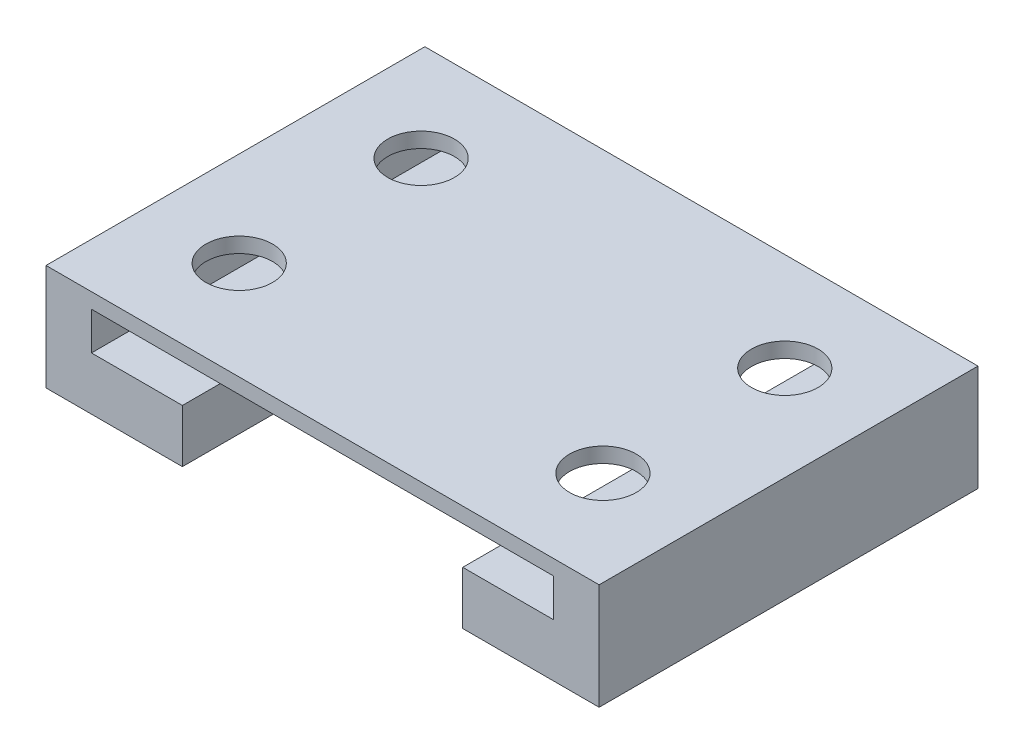
ISO-10303-21;
HEADER;
FILE_DESCRIPTION(('STEP AP214'),'2;1');
FILE_NAME('part.step','',(''),(''),'','','');
FILE_SCHEMA(('AUTOMOTIVE_DESIGN { 1 0 10303 214 1 1 1 1 }'));
ENDSEC;
DATA;
#1=APPLICATION_CONTEXT('core data for automotive mechanical design processes');
#2=APPLICATION_PROTOCOL_DEFINITION('international standard','automotive_design',2000,#1);
#3=PRODUCT_CONTEXT('',#1,'mechanical');
#4=PRODUCT('Part','Part','',(#3));
#5=PRODUCT_RELATED_PRODUCT_CATEGORY('part','',(#4));
#6=PRODUCT_DEFINITION_FORMATION('','',#4);
#7=PRODUCT_DEFINITION_CONTEXT('part definition',#1,'design');
#8=PRODUCT_DEFINITION('design','',#6,#7);
#9=PRODUCT_DEFINITION_SHAPE('','',#8);
#10=(LENGTH_UNIT() NAMED_UNIT(*) SI_UNIT(.MILLI.,.METRE.));
#11=(NAMED_UNIT(*) PLANE_ANGLE_UNIT() SI_UNIT($,.RADIAN.));
#12=(NAMED_UNIT(*) SI_UNIT($,.STERADIAN.) SOLID_ANGLE_UNIT());
#13=UNCERTAINTY_MEASURE_WITH_UNIT(LENGTH_MEASURE(1.E-05),#10,'distance_accuracy_value','');
#14=(GEOMETRIC_REPRESENTATION_CONTEXT(3) GLOBAL_UNCERTAINTY_ASSIGNED_CONTEXT((#13)) GLOBAL_UNIT_ASSIGNED_CONTEXT((#10,
#11,#12)) REPRESENTATION_CONTEXT('',''));
#15=CARTESIAN_POINT('',(0.,0.,0.));
#16=DIRECTION('',(0.,0.,1.));
#17=DIRECTION('',(1.,0.,0.));
#18=AXIS2_PLACEMENT_3D('',#15,#16,#17);
#19=CARTESIAN_POINT('',(-9.25000000000013,3.49999999999995,12.5000000000003));
#20=DIRECTION('',(-1.,0.,0.));
#21=DIRECTION('',(0.,-1.,0.));
#22=AXIS2_PLACEMENT_3D('',#19,#20,#21);
#23=PLANE('',#22);
#24=DIRECTION('',(0.,1.,0.));
#25=VECTOR('',#24,1.);
#26=CARTESIAN_POINT('',(-9.24999999999999,3.49999999999895,-12.5));
#27=LINE('',#26,#25);
#28=CARTESIAN_POINT('',(-9.24999999999999,-1.11022302462516E-12,-12.5));
#29=VERTEX_POINT('',#28);
#30=CARTESIAN_POINT('',(-9.24999999999999,3.49999999999895,-12.5));
#31=VERTEX_POINT('',#30);
#32=EDGE_CURVE('E165',#29,#31,#27,.T.);
#33=ORIENTED_EDGE('',*,*,#32,.T.);
#34=DIRECTION('',(0.,0.,-1.));
#35=VECTOR('',#34,1.);
#36=CARTESIAN_POINT('',(-9.25000000000013,3.49999999999995,12.5000000000003));
#37=LINE('',#36,#35);
#38=CARTESIAN_POINT('',(-9.25000000000013,3.49999999999995,12.5000000000003));
#39=VERTEX_POINT('',#38);
#40=EDGE_CURVE('E11',#39,#31,#37,.T.);
#41=ORIENTED_EDGE('',*,*,#40,.F.);
#42=DIRECTION('',(0.,1.,0.));
#43=VECTOR('',#42,1.);
#44=CARTESIAN_POINT('',(-9.25000000000013,3.49999999999995,12.5000000000003));
#45=LINE('',#44,#43);
#46=CARTESIAN_POINT('',(-9.25000000000013,0.,12.5000000000003));
#47=VERTEX_POINT('',#46);
#48=EDGE_CURVE('E200',#47,#39,#45,.T.);
#49=ORIENTED_EDGE('',*,*,#48,.F.);
#50=DIRECTION('',(0.,0.,-1.));
#51=VECTOR('',#50,1.);
#52=CARTESIAN_POINT('',(-9.25000000000013,0.,12.5000000000003));
#53=LINE('',#52,#51);
#54=EDGE_CURVE('E161',#47,#29,#53,.T.);
#55=ORIENTED_EDGE('',*,*,#54,.T.);
#56=EDGE_LOOP('',(#33,#41,#49,#55));
#57=FACE_BOUND('',#56,.T.);
#58=ADVANCED_FACE('F38',(#57),#23,.F.);
#59=CARTESIAN_POINT('',(-15.2500000000001,3.49999999999995,12.5));
#60=DIRECTION('',(0.,-1.,0.));
#61=DIRECTION('',(0.,0.,-1.));
#62=AXIS2_PLACEMENT_3D('',#59,#60,#61);
#63=PLANE('',#62);
#64=CARTESIAN_POINT('',(-12.,3.49999999999895,-6.00000000000028));
#65=DIRECTION('',(0.,-1.,0.));
#66=DIRECTION('',(0.,0.,-1.));
#67=AXIS2_PLACEMENT_3D('',#64,#65,#66);
#68=CIRCLE('',#67,1.2);
#69=CARTESIAN_POINT('',(-12.,3.49999999999895,-7.20000000000029));
#70=VERTEX_POINT('',#69);
#71=EDGE_CURVE('E278',#70,#70,#68,.T.);
#72=ORIENTED_EDGE('',*,*,#71,.T.);
#73=EDGE_LOOP('',(#72));
#74=FACE_BOUND('',#73,.T.);
#75=CARTESIAN_POINT('',(-12.,3.49999999999995,6.00000000000001));
#76=DIRECTION('',(0.,-1.,0.));
#77=DIRECTION('',(0.,0.,-1.));
#78=AXIS2_PLACEMENT_3D('',#75,#76,#77);
#79=CIRCLE('',#78,1.2);
#80=CARTESIAN_POINT('',(-12.,3.49999999999995,4.8));
#81=VERTEX_POINT('',#80);
#82=EDGE_CURVE('E315',#81,#81,#79,.T.);
#83=ORIENTED_EDGE('',*,*,#82,.T.);
#84=EDGE_LOOP('',(#83));
#85=FACE_BOUND('',#84,.T.);
#86=DIRECTION('',(-1.,0.,0.));
#87=VECTOR('',#86,1.);
#88=CARTESIAN_POINT('',(-15.25,3.49999999999895,-12.5000000000003));
#89=LINE('',#88,#87);
#90=CARTESIAN_POINT('',(-15.25,3.49999999999895,-12.5000000000003));
#91=VERTEX_POINT('',#90);
#92=EDGE_CURVE('E169',#31,#91,#89,.T.);
#93=ORIENTED_EDGE('',*,*,#92,.T.);
#94=DIRECTION('',(0.,0.,-1.));
#95=VECTOR('',#94,1.);
#96=CARTESIAN_POINT('',(-15.2500000000001,3.49999999999995,12.5));
#97=LINE('',#96,#95);
#98=CARTESIAN_POINT('',(-15.2500000000001,3.49999999999995,12.5));
#99=VERTEX_POINT('',#98);
#100=EDGE_CURVE('E47',#99,#91,#97,.T.);
#101=ORIENTED_EDGE('',*,*,#100,.F.);
#102=DIRECTION('',(-1.,0.,0.));
#103=VECTOR('',#102,1.);
#104=CARTESIAN_POINT('',(-15.2500000000001,3.49999999999995,12.5));
#105=LINE('',#104,#103);
#106=EDGE_CURVE('E110',#39,#99,#105,.T.);
#107=ORIENTED_EDGE('',*,*,#106,.F.);
#108=ORIENTED_EDGE('',*,*,#40,.T.);
#109=EDGE_LOOP('',(#93,#101,#107,#108));
#110=FACE_BOUND('',#109,.T.);
#111=ADVANCED_FACE('F341',(#74,#85,#110),#63,.F.);
#112=CARTESIAN_POINT('',(-15.2500000000001,6.00000000000001,12.5));
#113=DIRECTION('',(-1.,0.,0.));
#114=DIRECTION('',(0.,0.,1.));
#115=AXIS2_PLACEMENT_3D('',#112,#113,#114);
#116=PLANE('',#115);
#117=DIRECTION('',(0.,1.,0.));
#118=VECTOR('',#117,1.);
#119=CARTESIAN_POINT('',(-15.25,5.9999999999989,-12.5000000000003));
#120=LINE('',#119,#118);
#121=CARTESIAN_POINT('',(-15.25,5.9999999999989,-12.5000000000003));
#122=VERTEX_POINT('',#121);
#123=EDGE_CURVE('E173',#91,#122,#120,.T.);
#124=ORIENTED_EDGE('',*,*,#123,.T.);
#125=DIRECTION('',(0.,0.,-1.));
#126=VECTOR('',#125,1.);
#127=CARTESIAN_POINT('',(-15.2500000000001,6.00000000000001,12.5));
#128=LINE('',#127,#126);
#129=CARTESIAN_POINT('',(-15.2500000000001,6.00000000000001,12.5));
#130=VERTEX_POINT('',#129);
#131=EDGE_CURVE('E226',#130,#122,#128,.T.);
#132=ORIENTED_EDGE('',*,*,#131,.F.);
#133=DIRECTION('',(0.,1.,0.));
#134=VECTOR('',#133,1.);
#135=CARTESIAN_POINT('',(-15.2500000000001,6.00000000000001,12.5));
#136=LINE('',#135,#134);
#137=EDGE_CURVE('E238',#99,#130,#136,.T.);
#138=ORIENTED_EDGE('',*,*,#137,.F.);
#139=ORIENTED_EDGE('',*,*,#100,.T.);
#140=EDGE_LOOP('',(#124,#132,#138,#139));
#141=FACE_BOUND('',#140,.T.);
#142=ADVANCED_FACE('F236',(#141),#116,.F.);
#143=CARTESIAN_POINT('',(15.2500000000003,6.00000000000006,12.5000000000003));
#144=DIRECTION('',(0.,1.,0.));
#145=DIRECTION('',(-1.,0.,0.));
#146=AXIS2_PLACEMENT_3D('',#143,#144,#145);
#147=PLANE('',#146);
#148=CARTESIAN_POINT('',(-12.,5.9999999999989,-6.00000000000028));
#149=DIRECTION('',(0.,1.,0.));
#150=DIRECTION('',(-1.,0.,0.));
#151=AXIS2_PLACEMENT_3D('',#148,#149,#150);
#152=CIRCLE('',#151,2.2);
#153=CARTESIAN_POINT('',(-14.2,5.9999999999989,-6.00000000000028));
#154=VERTEX_POINT('',#153);
#155=EDGE_CURVE('E272',#154,#154,#152,.F.);
#156=ORIENTED_EDGE('',*,*,#155,.F.);
#157=EDGE_LOOP('',(#156));
#158=FACE_BOUND('',#157,.T.);
#159=CARTESIAN_POINT('',(12.,6.00000000000106,-6.00000000000028));
#160=DIRECTION('',(0.,1.,0.));
#161=DIRECTION('',(-1.,0.,0.));
#162=AXIS2_PLACEMENT_3D('',#159,#160,#161);
#163=CIRCLE('',#162,2.2);
#164=CARTESIAN_POINT('',(9.79999999999997,6.00000000000106,-6.00000000000028));
#165=VERTEX_POINT('',#164);
#166=EDGE_CURVE('E289',#165,#165,#163,.F.);
#167=ORIENTED_EDGE('',*,*,#166,.F.);
#168=EDGE_LOOP('',(#167));
#169=FACE_BOUND('',#168,.T.);
#170=CARTESIAN_POINT('',(12.,6.00000000000006,6.00000000000001));
#171=DIRECTION('',(0.,1.,0.));
#172=DIRECTION('',(-1.,0.,0.));
#173=AXIS2_PLACEMENT_3D('',#170,#171,#172);
#174=CIRCLE('',#173,2.2);
#175=CARTESIAN_POINT('',(9.79999999999997,6.00000000000006,6.00000000000001));
#176=VERTEX_POINT('',#175);
#177=EDGE_CURVE('E284',#176,#176,#174,.F.);
#178=ORIENTED_EDGE('',*,*,#177,.F.);
#179=EDGE_LOOP('',(#178));
#180=FACE_BOUND('',#179,.T.);
#181=CARTESIAN_POINT('',(-12.,6.00000000000001,6.00000000000001));
#182=DIRECTION('',(0.,1.,0.));
#183=DIRECTION('',(-1.,0.,0.));
#184=AXIS2_PLACEMENT_3D('',#181,#182,#183);
#185=CIRCLE('',#184,2.2);
#186=CARTESIAN_POINT('',(-14.2,6.00000000000001,6.00000000000001));
#187=VERTEX_POINT('',#186);
#188=EDGE_CURVE('E306',#187,#187,#185,.F.);
#189=ORIENTED_EDGE('',*,*,#188,.F.);
#190=EDGE_LOOP('',(#189));
#191=FACE_BOUND('',#190,.T.);
#192=DIRECTION('',(1.,0.,0.));
#193=VECTOR('',#192,1.);
#194=CARTESIAN_POINT('',(15.2500000000003,5.99999999999995,-12.5));
#195=LINE('',#194,#193);
#196=CARTESIAN_POINT('',(15.2500000000003,5.99999999999995,-12.5));
#197=VERTEX_POINT('',#196);
#198=EDGE_CURVE('E176',#122,#197,#195,.T.);
#199=ORIENTED_EDGE('',*,*,#198,.T.);
#200=DIRECTION('',(0.,0.,-1.));
#201=VECTOR('',#200,1.);
#202=CARTESIAN_POINT('',(15.2500000000003,6.00000000000006,12.5000000000003));
#203=LINE('',#202,#201);
#204=CARTESIAN_POINT('',(15.2500000000003,6.00000000000006,12.5000000000003));
#205=VERTEX_POINT('',#204);
#206=EDGE_CURVE('E222',#205,#197,#203,.T.);
#207=ORIENTED_EDGE('',*,*,#206,.F.);
#208=DIRECTION('',(1.,0.,0.));
#209=VECTOR('',#208,1.);
#210=CARTESIAN_POINT('',(15.2500000000003,6.00000000000006,12.5000000000003));
#211=LINE('',#210,#209);
#212=EDGE_CURVE('E257',#130,#205,#211,.T.);
#213=ORIENTED_EDGE('',*,*,#212,.F.);
#214=ORIENTED_EDGE('',*,*,#131,.T.);
#215=EDGE_LOOP('',(#199,#207,#213,#214));
#216=FACE_BOUND('',#215,.T.);
#217=ADVANCED_FACE('F247',(#158,#169,#180,#191,#216),#147,.F.);
#218=CARTESIAN_POINT('',(15.2500000000003,3.5,12.5000000000003));
#219=DIRECTION('',(1.,0.,0.));
#220=DIRECTION('',(0.,0.,-1.));
#221=AXIS2_PLACEMENT_3D('',#218,#219,#220);
#222=PLANE('',#221);
#223=DIRECTION('',(0.,-1.,0.));
#224=VECTOR('',#223,1.);
#225=CARTESIAN_POINT('',(15.2500000000002,3.5,-12.5));
#226=LINE('',#225,#224);
#227=CARTESIAN_POINT('',(15.2500000000002,3.5,-12.5));
#228=VERTEX_POINT('',#227);
#229=EDGE_CURVE('E179',#197,#228,#226,.T.);
#230=ORIENTED_EDGE('',*,*,#229,.T.);
#231=DIRECTION('',(0.,0.,-1.));
#232=VECTOR('',#231,1.);
#233=CARTESIAN_POINT('',(15.2500000000003,3.5,12.5000000000003));
#234=LINE('',#233,#232);
#235=CARTESIAN_POINT('',(15.2500000000003,3.5,12.5000000000003));
#236=VERTEX_POINT('',#235);
#237=EDGE_CURVE('E218',#236,#228,#234,.T.);
#238=ORIENTED_EDGE('',*,*,#237,.F.);
#239=DIRECTION('',(0.,-1.,0.));
#240=VECTOR('',#239,1.);
#241=CARTESIAN_POINT('',(15.2500000000003,3.5,12.5000000000003));
#242=LINE('',#241,#240);
#243=EDGE_CURVE('E253',#205,#236,#242,.T.);
#244=ORIENTED_EDGE('',*,*,#243,.F.);
#245=ORIENTED_EDGE('',*,*,#206,.T.);
#246=EDGE_LOOP('',(#230,#238,#244,#245));
#247=FACE_BOUND('',#246,.T.);
#248=ADVANCED_FACE('F251',(#247),#222,.F.);
#249=CARTESIAN_POINT('',(9.25000000000029,3.5,12.5));
#250=DIRECTION('',(0.,-1.,0.));
#251=DIRECTION('',(1.,0.,0.));
#252=AXIS2_PLACEMENT_3D('',#249,#250,#251);
#253=PLANE('',#252);
#254=CARTESIAN_POINT('',(12.,3.5,6.00000000000001));
#255=DIRECTION('',(0.,-1.,0.));
#256=DIRECTION('',(1.,0.,0.));
#257=AXIS2_PLACEMENT_3D('',#254,#255,#256);
#258=CIRCLE('',#257,1.2);
#259=CARTESIAN_POINT('',(13.2,3.5,6.00000000000001));
#260=VERTEX_POINT('',#259);
#261=EDGE_CURVE('E323',#260,#260,#258,.T.);
#262=ORIENTED_EDGE('',*,*,#261,.T.);
#263=EDGE_LOOP('',(#262));
#264=FACE_BOUND('',#263,.T.);
#265=CARTESIAN_POINT('',(11.9999999999999,3.50000000000011,-6.00000000000028));
#266=DIRECTION('',(0.,-1.,0.));
#267=DIRECTION('',(1.,0.,0.));
#268=AXIS2_PLACEMENT_3D('',#265,#266,#267);
#269=CIRCLE('',#268,1.2);
#270=CARTESIAN_POINT('',(13.1999999999999,3.50000000000011,-6.00000000000028));
#271=VERTEX_POINT('',#270);
#272=EDGE_CURVE('E170',#271,#271,#269,.T.);
#273=ORIENTED_EDGE('',*,*,#272,.T.);
#274=EDGE_LOOP('',(#273));
#275=FACE_BOUND('',#274,.T.);
#276=DIRECTION('',(-1.,0.,0.));
#277=VECTOR('',#276,1.);
#278=CARTESIAN_POINT('',(9.25000000000009,3.5,-12.5000000000003));
#279=LINE('',#278,#277);
#280=CARTESIAN_POINT('',(9.25000000000009,3.5,-12.5000000000003));
#281=VERTEX_POINT('',#280);
#282=EDGE_CURVE('E182',#228,#281,#279,.T.);
#283=ORIENTED_EDGE('',*,*,#282,.T.);
#284=DIRECTION('',(0.,0.,-1.));
#285=VECTOR('',#284,1.);
#286=CARTESIAN_POINT('',(9.25000000000029,3.5,12.5));
#287=LINE('',#286,#285);
#288=CARTESIAN_POINT('',(9.25000000000029,3.5,12.5));
#289=VERTEX_POINT('',#288);
#290=EDGE_CURVE('E214',#289,#281,#287,.T.);
#291=ORIENTED_EDGE('',*,*,#290,.F.);
#292=DIRECTION('',(-1.,0.,0.));
#293=VECTOR('',#292,1.);
#294=CARTESIAN_POINT('',(9.25000000000029,3.5,12.5));
#295=LINE('',#294,#293);
#296=EDGE_CURVE('E256',#236,#289,#295,.T.);
#297=ORIENTED_EDGE('',*,*,#296,.F.);
#298=ORIENTED_EDGE('',*,*,#237,.T.);
#299=EDGE_LOOP('',(#283,#291,#297,#298));
#300=FACE_BOUND('',#299,.T.);
#301=ADVANCED_FACE('F356',(#264,#275,#300),#253,.F.);
#302=CARTESIAN_POINT('',(9.25000000000029,0.,12.5));
#303=DIRECTION('',(1.,0.,0.));
#304=DIRECTION('',(0.,1.,0.));
#305=AXIS2_PLACEMENT_3D('',#302,#303,#304);
#306=PLANE('',#305);
#307=DIRECTION('',(0.,-1.,0.));
#308=VECTOR('',#307,1.);
#309=CARTESIAN_POINT('',(9.25000000000009,0.,-12.5000000000003));
#310=LINE('',#309,#308);
#311=CARTESIAN_POINT('',(9.25000000000009,0.,-12.5000000000003));
#312=VERTEX_POINT('',#311);
#313=EDGE_CURVE('E185',#281,#312,#310,.T.);
#314=ORIENTED_EDGE('',*,*,#313,.T.);
#315=DIRECTION('',(0.,0.,-1.));
#316=VECTOR('',#315,1.);
#317=CARTESIAN_POINT('',(9.25000000000029,0.,12.5));
#318=LINE('',#317,#316);
#319=CARTESIAN_POINT('',(9.25000000000029,0.,12.5));
#320=VERTEX_POINT('',#319);
#321=EDGE_CURVE('E210',#320,#312,#318,.T.);
#322=ORIENTED_EDGE('',*,*,#321,.F.);
#323=DIRECTION('',(0.,-1.,0.));
#324=VECTOR('',#323,1.);
#325=CARTESIAN_POINT('',(9.25000000000029,0.,12.5));
#326=LINE('',#325,#324);
#327=EDGE_CURVE('E262',#289,#320,#326,.T.);
#328=ORIENTED_EDGE('',*,*,#327,.F.);
#329=ORIENTED_EDGE('',*,*,#290,.T.);
#330=EDGE_LOOP('',(#314,#322,#328,#329));
#331=FACE_BOUND('',#330,.T.);
#332=ADVANCED_FACE('F359',(#331),#306,.F.);
#333=CARTESIAN_POINT('',(18.2500000000002,0.,12.5000000000005));
#334=DIRECTION('',(0.,1.,0.));
#335=DIRECTION('',(-1.,0.,0.));
#336=AXIS2_PLACEMENT_3D('',#333,#334,#335);
#337=PLANE('',#336);
#338=CARTESIAN_POINT('',(12.,0.,6.00000000000001));
#339=DIRECTION('',(0.,1.,0.));
#340=DIRECTION('',(0.,0.,1.));
#341=AXIS2_PLACEMENT_3D('',#338,#339,#340);
#342=CIRCLE('',#341,1.2);
#343=CARTESIAN_POINT('',(12.,0.,7.20000000000001));
#344=VERTEX_POINT('',#343);
#345=EDGE_CURVE('E319',#344,#344,#342,.T.);
#346=ORIENTED_EDGE('',*,*,#345,.T.);
#347=EDGE_LOOP('',(#346));
#348=FACE_BOUND('',#347,.T.);
#349=CARTESIAN_POINT('',(11.9999999999999,1.0547118733939E-12,-6.00000000000028));
#350=DIRECTION('',(0.,1.,0.));
#351=DIRECTION('',(0.,0.,1.));
#352=AXIS2_PLACEMENT_3D('',#349,#350,#351);
#353=CIRCLE('',#352,1.2);
#354=CARTESIAN_POINT('',(11.9999999999999,1.0547118733939E-12,-4.80000000000028));
#355=VERTEX_POINT('',#354);
#356=EDGE_CURVE('E327',#355,#355,#353,.T.);
#357=ORIENTED_EDGE('',*,*,#356,.T.);
#358=EDGE_LOOP('',(#357));
#359=FACE_BOUND('',#358,.T.);
#360=DIRECTION('',(1.,0.,0.));
#361=VECTOR('',#360,1.);
#362=CARTESIAN_POINT('',(18.2500000000002,0.,-12.5000000000001));
#363=LINE('',#362,#361);
#364=CARTESIAN_POINT('',(18.2500000000002,0.,-12.5000000000001));
#365=VERTEX_POINT('',#364);
#366=EDGE_CURVE('E188',#312,#365,#363,.T.);
#367=ORIENTED_EDGE('',*,*,#366,.T.);
#368=DIRECTION('',(0.,0.,-1.));
#369=VECTOR('',#368,1.);
#370=CARTESIAN_POINT('',(18.2500000000002,0.,12.5000000000005));
#371=LINE('',#370,#369);
#372=CARTESIAN_POINT('',(18.2500000000002,0.,12.5000000000005));
#373=VERTEX_POINT('',#372);
#374=EDGE_CURVE('E206',#373,#365,#371,.T.);
#375=ORIENTED_EDGE('',*,*,#374,.F.);
#376=DIRECTION('',(1.,0.,0.));
#377=VECTOR('',#376,1.);
#378=CARTESIAN_POINT('',(18.2500000000002,0.,12.5000000000005));
#379=LINE('',#378,#377);
#380=EDGE_CURVE('E268',#320,#373,#379,.T.);
#381=ORIENTED_EDGE('',*,*,#380,.F.);
#382=ORIENTED_EDGE('',*,*,#321,.T.);
#383=EDGE_LOOP('',(#367,#375,#381,#382));
#384=FACE_BOUND('',#383,.T.);
#385=ADVANCED_FACE('F363',(#348,#359,#384),#337,.F.);
#386=CARTESIAN_POINT('',(18.2500000000002,7.00000000000006,12.5000000000005));
#387=DIRECTION('',(-1.,0.,0.));
#388=DIRECTION('',(0.,0.,1.));
#389=AXIS2_PLACEMENT_3D('',#386,#387,#388);
#390=PLANE('',#389);
#391=DIRECTION('',(0.,1.,0.));
#392=VECTOR('',#391,1.);
#393=CARTESIAN_POINT('',(18.2500000000002,6.99999999999995,-12.5));
#394=LINE('',#393,#392);
#395=CARTESIAN_POINT('',(18.2500000000002,6.99999999999995,-12.5));
#396=VERTEX_POINT('',#395);
#397=EDGE_CURVE('E191',#365,#396,#394,.T.);
#398=ORIENTED_EDGE('',*,*,#397,.T.);
#399=DIRECTION('',(0.,0.,-1.));
#400=VECTOR('',#399,1.);
#401=CARTESIAN_POINT('',(18.2500000000002,7.00000000000006,12.5000000000005));
#402=LINE('',#401,#400);
#403=CARTESIAN_POINT('',(18.2500000000002,7.00000000000006,12.5000000000005));
#404=VERTEX_POINT('',#403);
#405=EDGE_CURVE('E152',#404,#396,#402,.T.);
#406=ORIENTED_EDGE('',*,*,#405,.F.);
#407=DIRECTION('',(0.,1.,0.));
#408=VECTOR('',#407,1.);
#409=CARTESIAN_POINT('',(18.2500000000002,7.00000000000006,12.5000000000005));
#410=LINE('',#409,#408);
#411=EDGE_CURVE('E141',#373,#404,#410,.T.);
#412=ORIENTED_EDGE('',*,*,#411,.F.);
#413=ORIENTED_EDGE('',*,*,#374,.T.);
#414=EDGE_LOOP('',(#398,#406,#412,#413));
#415=FACE_BOUND('',#414,.T.);
#416=ADVANCED_FACE('F367',(#415),#390,.F.);
#417=CARTESIAN_POINT('',(-18.2500000000001,7.00000000000001,12.5000000000003));
#418=DIRECTION('',(0.,-1.,0.));
#419=DIRECTION('',(1.,0.,0.));
#420=AXIS2_PLACEMENT_3D('',#417,#418,#419);
#421=PLANE('',#420);
#422=CARTESIAN_POINT('',(-12.,6.9999999999989,-6.00000000000028));
#423=DIRECTION('',(0.,1.,0.));
#424=DIRECTION('',(-1.,0.,0.));
#425=AXIS2_PLACEMENT_3D('',#422,#423,#424);
#426=CIRCLE('',#425,2.2);
#427=CARTESIAN_POINT('',(-14.2,6.9999999999989,-6.00000000000028));
#428=VERTEX_POINT('',#427);
#429=EDGE_CURVE('E275',#428,#428,#426,.T.);
#430=ORIENTED_EDGE('',*,*,#429,.F.);
#431=EDGE_LOOP('',(#430));
#432=FACE_BOUND('',#431,.T.);
#433=CARTESIAN_POINT('',(-12.,7.00000000000001,6.00000000000001));
#434=DIRECTION('',(0.,1.,0.));
#435=DIRECTION('',(-1.,0.,0.));
#436=AXIS2_PLACEMENT_3D('',#433,#434,#435);
#437=CIRCLE('',#436,2.2);
#438=CARTESIAN_POINT('',(-14.2,7.00000000000001,6.00000000000001));
#439=VERTEX_POINT('',#438);
#440=EDGE_CURVE('E286',#439,#439,#437,.T.);
#441=ORIENTED_EDGE('',*,*,#440,.F.);
#442=EDGE_LOOP('',(#441));
#443=FACE_BOUND('',#442,.T.);
#444=CARTESIAN_POINT('',(12.,7.00000000000006,6.00000000000001));
#445=DIRECTION('',(0.,1.,0.));
#446=DIRECTION('',(-1.,0.,0.));
#447=AXIS2_PLACEMENT_3D('',#444,#445,#446);
#448=CIRCLE('',#447,2.2);
#449=CARTESIAN_POINT('',(9.79999999999997,7.00000000000006,6.00000000000001));
#450=VERTEX_POINT('',#449);
#451=EDGE_CURVE('E287',#450,#450,#448,.T.);
#452=ORIENTED_EDGE('',*,*,#451,.F.);
#453=EDGE_LOOP('',(#452));
#454=FACE_BOUND('',#453,.T.);
#455=CARTESIAN_POINT('',(12.,7.00000000000106,-6.00000000000028));
#456=DIRECTION('',(0.,1.,0.));
#457=DIRECTION('',(-1.,0.,0.));
#458=AXIS2_PLACEMENT_3D('',#455,#456,#457);
#459=CIRCLE('',#458,2.2);
#460=CARTESIAN_POINT('',(9.79999999999997,7.00000000000106,-6.00000000000028));
#461=VERTEX_POINT('',#460);
#462=EDGE_CURVE('E274',#461,#461,#459,.T.);
#463=ORIENTED_EDGE('',*,*,#462,.F.);
#464=EDGE_LOOP('',(#463));
#465=FACE_BOUND('',#464,.T.);
#466=DIRECTION('',(-1.,0.,0.));
#467=VECTOR('',#466,1.);
#468=CARTESIAN_POINT('',(-18.25,6.9999999999989,-12.5000000000003));
#469=LINE('',#468,#467);
#470=CARTESIAN_POINT('',(-18.25,6.9999999999989,-12.5000000000003));
#471=VERTEX_POINT('',#470);
#472=EDGE_CURVE('E150',#396,#471,#469,.T.);
#473=ORIENTED_EDGE('',*,*,#472,.T.);
#474=DIRECTION('',(0.,0.,-1.));
#475=VECTOR('',#474,1.);
#476=CARTESIAN_POINT('',(-18.2500000000001,7.00000000000001,12.5000000000003));
#477=LINE('',#476,#475);
#478=CARTESIAN_POINT('',(-18.2500000000001,7.00000000000001,12.5000000000003));
#479=VERTEX_POINT('',#478);
#480=EDGE_CURVE('E147',#479,#471,#477,.T.);
#481=ORIENTED_EDGE('',*,*,#480,.F.);
#482=DIRECTION('',(-1.,0.,0.));
#483=VECTOR('',#482,1.);
#484=CARTESIAN_POINT('',(-18.2500000000001,7.00000000000001,12.5000000000003));
#485=LINE('',#484,#483);
#486=EDGE_CURVE('E135',#404,#479,#485,.T.);
#487=ORIENTED_EDGE('',*,*,#486,.F.);
#488=ORIENTED_EDGE('',*,*,#405,.T.);
#489=EDGE_LOOP('',(#473,#481,#487,#488));
#490=FACE_BOUND('',#489,.T.);
#491=ADVANCED_FACE('F148',(#432,#443,#454,#465,#490),#421,.F.);
#492=CARTESIAN_POINT('',(-18.2500000000001,0.,12.5000000000001));
#493=DIRECTION('',(1.,0.,0.));
#494=DIRECTION('',(0.,0.,-1.));
#495=AXIS2_PLACEMENT_3D('',#492,#493,#494);
#496=PLANE('',#495);
#497=DIRECTION('',(0.,-1.,0.));
#498=VECTOR('',#497,1.);
#499=CARTESIAN_POINT('',(-18.25,-1.11022302462516E-12,-12.5000000000005));
#500=LINE('',#499,#498);
#501=CARTESIAN_POINT('',(-18.25,-1.11022302462516E-12,-12.5000000000005));
#502=VERTEX_POINT('',#501);
#503=EDGE_CURVE('E96',#471,#502,#500,.T.);
#504=ORIENTED_EDGE('',*,*,#503,.T.);
#505=DIRECTION('',(0.,0.,-1.));
#506=VECTOR('',#505,1.);
#507=CARTESIAN_POINT('',(-18.2500000000001,0.,12.5000000000001));
#508=LINE('',#507,#506);
#509=CARTESIAN_POINT('',(-18.2500000000001,0.,12.5000000000001));
#510=VERTEX_POINT('',#509);
#511=EDGE_CURVE('E153',#510,#502,#508,.T.);
#512=ORIENTED_EDGE('',*,*,#511,.F.);
#513=DIRECTION('',(0.,-1.,0.));
#514=VECTOR('',#513,1.);
#515=CARTESIAN_POINT('',(-18.2500000000001,0.,12.5000000000001));
#516=LINE('',#515,#514);
#517=EDGE_CURVE('E139',#479,#510,#516,.T.);
#518=ORIENTED_EDGE('',*,*,#517,.F.);
#519=ORIENTED_EDGE('',*,*,#480,.T.);
#520=EDGE_LOOP('',(#504,#512,#518,#519));
#521=FACE_BOUND('',#520,.T.);
#522=ADVANCED_FACE('F155',(#521),#496,.F.);
#523=CARTESIAN_POINT('',(-9.25000000000013,0.,12.5000000000003));
#524=DIRECTION('',(0.,1.,0.));
#525=DIRECTION('',(-1.,0.,0.));
#526=AXIS2_PLACEMENT_3D('',#523,#524,#525);
#527=PLANE('',#526);
#528=CARTESIAN_POINT('',(-12.,-1.11022302462516E-12,-6.00000000000028));
#529=DIRECTION('',(0.,1.,0.));
#530=DIRECTION('',(0.,0.,1.));
#531=AXIS2_PLACEMENT_3D('',#528,#529,#530);
#532=CIRCLE('',#531,1.2);
#533=CARTESIAN_POINT('',(-12.,-1.11022302462516E-12,-4.80000000000028));
#534=VERTEX_POINT('',#533);
#535=EDGE_CURVE('E282',#534,#534,#532,.T.);
#536=ORIENTED_EDGE('',*,*,#535,.T.);
#537=EDGE_LOOP('',(#536));
#538=FACE_BOUND('',#537,.T.);
#539=CARTESIAN_POINT('',(-12.,0.,6.00000000000001));
#540=DIRECTION('',(0.,1.,0.));
#541=DIRECTION('',(0.,0.,1.));
#542=AXIS2_PLACEMENT_3D('',#539,#540,#541);
#543=CIRCLE('',#542,1.2);
#544=CARTESIAN_POINT('',(-12.,0.,7.20000000000001));
#545=VERTEX_POINT('',#544);
#546=EDGE_CURVE('E281',#545,#545,#543,.T.);
#547=ORIENTED_EDGE('',*,*,#546,.T.);
#548=EDGE_LOOP('',(#547));
#549=FACE_BOUND('',#548,.T.);
#550=DIRECTION('',(1.,0.,0.));
#551=VECTOR('',#550,1.);
#552=CARTESIAN_POINT('',(-9.24999999999999,-1.11022302462516E-12,-12.5));
#553=LINE('',#552,#551);
#554=EDGE_CURVE('E102',#502,#29,#553,.T.);
#555=ORIENTED_EDGE('',*,*,#554,.T.);
#556=ORIENTED_EDGE('',*,*,#54,.F.);
#557=DIRECTION('',(1.,0.,0.));
#558=VECTOR('',#557,1.);
#559=CARTESIAN_POINT('',(-9.25000000000013,0.,12.5000000000003));
#560=LINE('',#559,#558);
#561=EDGE_CURVE('E55',#510,#47,#560,.T.);
#562=ORIENTED_EDGE('',*,*,#561,.F.);
#563=ORIENTED_EDGE('',*,*,#511,.T.);
#564=EDGE_LOOP('',(#555,#556,#562,#563));
#565=FACE_BOUND('',#564,.T.);
#566=ADVANCED_FACE('F377',(#538,#549,#565),#527,.F.);
#567=CARTESIAN_POINT('',(-1.38777878078145E-13,0.,12.5));
#568=DIRECTION('',(0.,0.,-1.));
#569=DIRECTION('',(-1.,0.,0.));
#570=AXIS2_PLACEMENT_3D('',#567,#568,#569);
#571=PLANE('',#570);
#572=ORIENTED_EDGE('',*,*,#48,.T.);
#573=ORIENTED_EDGE('',*,*,#106,.T.);
#574=ORIENTED_EDGE('',*,*,#137,.T.);
#575=ORIENTED_EDGE('',*,*,#212,.T.);
#576=ORIENTED_EDGE('',*,*,#243,.T.);
#577=ORIENTED_EDGE('',*,*,#296,.T.);
#578=ORIENTED_EDGE('',*,*,#327,.T.);
#579=ORIENTED_EDGE('',*,*,#380,.T.);
#580=ORIENTED_EDGE('',*,*,#411,.T.);
#581=ORIENTED_EDGE('',*,*,#486,.T.);
#582=ORIENTED_EDGE('',*,*,#517,.T.);
#583=ORIENTED_EDGE('',*,*,#561,.T.);
#584=EDGE_LOOP('',(#572,#573,#574,#575,#576,#577,#578,#579,#580,#581,#582,#583));
#585=FACE_BOUND('',#584,.T.);
#586=ADVANCED_FACE('F137',(#585),#571,.F.);
#587=CARTESIAN_POINT('',(0.,-1.11022302462516E-12,-12.5000000000003));
#588=DIRECTION('',(0.,0.,-1.));
#589=DIRECTION('',(-1.,0.,0.));
#590=AXIS2_PLACEMENT_3D('',#587,#588,#589);
#591=PLANE('',#590);
#592=ORIENTED_EDGE('',*,*,#32,.F.);
#593=ORIENTED_EDGE('',*,*,#554,.F.);
#594=ORIENTED_EDGE('',*,*,#503,.F.);
#595=ORIENTED_EDGE('',*,*,#472,.F.);
#596=ORIENTED_EDGE('',*,*,#397,.F.);
#597=ORIENTED_EDGE('',*,*,#366,.F.);
#598=ORIENTED_EDGE('',*,*,#313,.F.);
#599=ORIENTED_EDGE('',*,*,#282,.F.);
#600=ORIENTED_EDGE('',*,*,#229,.F.);
#601=ORIENTED_EDGE('',*,*,#198,.F.);
#602=ORIENTED_EDGE('',*,*,#123,.F.);
#603=ORIENTED_EDGE('',*,*,#92,.F.);
#604=EDGE_LOOP('',(#592,#593,#594,#595,#596,#597,#598,#599,#600,#601,#602,#603));
#605=FACE_BOUND('',#604,.T.);
#606=ADVANCED_FACE('F242',(#605),#591,.T.);
#607=CARTESIAN_POINT('',(12.,7.00000000000106,-6.00000000000028));
#608=DIRECTION('',(0.,1.,0.));
#609=DIRECTION('',(0.,0.,1.));
#610=AXIS2_PLACEMENT_3D('',#607,#608,#609);
#611=CYLINDRICAL_SURFACE('',#610,1.2);
#612=ORIENTED_EDGE('',*,*,#356,.F.);
#613=EDGE_LOOP('',(#612));
#614=FACE_BOUND('',#613,.T.);
#615=ORIENTED_EDGE('',*,*,#272,.F.);
#616=EDGE_LOOP('',(#615));
#617=FACE_BOUND('',#616,.T.);
#618=ADVANCED_FACE('F383',(#614,#617),#611,.F.);
#619=CARTESIAN_POINT('',(12.,7.00000000000006,6.00000000000001));
#620=DIRECTION('',(0.,1.,0.));
#621=DIRECTION('',(0.,0.,1.));
#622=AXIS2_PLACEMENT_3D('',#619,#620,#621);
#623=CYLINDRICAL_SURFACE('',#622,1.2);
#624=ORIENTED_EDGE('',*,*,#345,.F.);
#625=EDGE_LOOP('',(#624));
#626=FACE_BOUND('',#625,.T.);
#627=ORIENTED_EDGE('',*,*,#261,.F.);
#628=EDGE_LOOP('',(#627));
#629=FACE_BOUND('',#628,.T.);
#630=ADVANCED_FACE('F388',(#626,#629),#623,.F.);
#631=CARTESIAN_POINT('',(-12.,7.00000000000001,6.00000000000001));
#632=DIRECTION('',(0.,1.,0.));
#633=DIRECTION('',(0.,0.,1.));
#634=AXIS2_PLACEMENT_3D('',#631,#632,#633);
#635=CYLINDRICAL_SURFACE('',#634,1.2);
#636=ORIENTED_EDGE('',*,*,#546,.F.);
#637=EDGE_LOOP('',(#636));
#638=FACE_BOUND('',#637,.T.);
#639=ORIENTED_EDGE('',*,*,#82,.F.);
#640=EDGE_LOOP('',(#639));
#641=FACE_BOUND('',#640,.T.);
#642=ADVANCED_FACE('F392',(#638,#641),#635,.F.);
#643=CARTESIAN_POINT('',(-12.,6.9999999999989,-6.00000000000028));
#644=DIRECTION('',(0.,1.,0.));
#645=DIRECTION('',(0.,0.,1.));
#646=AXIS2_PLACEMENT_3D('',#643,#644,#645);
#647=CYLINDRICAL_SURFACE('',#646,1.2);
#648=ORIENTED_EDGE('',*,*,#535,.F.);
#649=EDGE_LOOP('',(#648));
#650=FACE_BOUND('',#649,.T.);
#651=ORIENTED_EDGE('',*,*,#71,.F.);
#652=EDGE_LOOP('',(#651));
#653=FACE_BOUND('',#652,.T.);
#654=ADVANCED_FACE('F396',(#650,#653),#647,.F.);
#655=CARTESIAN_POINT('',(-12.,-0.00100000000113898,-6.00000000000028));
#656=DIRECTION('',(0.,1.,0.));
#657=DIRECTION('',(-1.,0.,0.));
#658=AXIS2_PLACEMENT_3D('',#655,#656,#657);
#659=CYLINDRICAL_SURFACE('',#658,2.2);
#660=ORIENTED_EDGE('',*,*,#429,.T.);
#661=EDGE_LOOP('',(#660));
#662=FACE_BOUND('',#661,.T.);
#663=ORIENTED_EDGE('',*,*,#155,.T.);
#664=EDGE_LOOP('',(#663));
#665=FACE_BOUND('',#664,.T.);
#666=ADVANCED_FACE('F400',(#662,#665),#659,.F.);
#667=CARTESIAN_POINT('',(-12.,-0.00100000000002876,6.00000000000001));
#668=DIRECTION('',(0.,1.,0.));
#669=DIRECTION('',(-1.,0.,0.));
#670=AXIS2_PLACEMENT_3D('',#667,#668,#669);
#671=CYLINDRICAL_SURFACE('',#670,2.2);
#672=ORIENTED_EDGE('',*,*,#440,.T.);
#673=EDGE_LOOP('',(#672));
#674=FACE_BOUND('',#673,.T.);
#675=ORIENTED_EDGE('',*,*,#188,.T.);
#676=EDGE_LOOP('',(#675));
#677=FACE_BOUND('',#676,.T.);
#678=ADVANCED_FACE('F402',(#674,#677),#671,.F.);
#679=CARTESIAN_POINT('',(12.,-0.000999999999973245,6.00000000000001));
#680=DIRECTION('',(0.,1.,0.));
#681=DIRECTION('',(-1.,0.,0.));
#682=AXIS2_PLACEMENT_3D('',#679,#680,#681);
#683=CYLINDRICAL_SURFACE('',#682,2.2);
#684=ORIENTED_EDGE('',*,*,#451,.T.);
#685=EDGE_LOOP('',(#684));
#686=FACE_BOUND('',#685,.T.);
#687=ORIENTED_EDGE('',*,*,#177,.T.);
#688=EDGE_LOOP('',(#687));
#689=FACE_BOUND('',#688,.T.);
#690=ADVANCED_FACE('F405',(#686,#689),#683,.F.);
#691=CARTESIAN_POINT('',(11.9999999999999,-0.000999999998974044,-6.00000000000028));
#692=DIRECTION('',(0.,1.,0.));
#693=DIRECTION('',(-1.,0.,0.));
#694=AXIS2_PLACEMENT_3D('',#691,#692,#693);
#695=CYLINDRICAL_SURFACE('',#694,2.2);
#696=ORIENTED_EDGE('',*,*,#462,.T.);
#697=EDGE_LOOP('',(#696));
#698=FACE_BOUND('',#697,.T.);
#699=ORIENTED_EDGE('',*,*,#166,.T.);
#700=EDGE_LOOP('',(#699));
#701=FACE_BOUND('',#700,.T.);
#702=ADVANCED_FACE('F410',(#698,#701),#695,.F.);
#703=CLOSED_SHELL('',(#58,#111,#142,#217,#248,#301,#332,#385,#416,#491,#522,#566,#586,#606,#618,
#630,#642,#654,#666,#678,#690,#702));
#704=MANIFOLD_SOLID_BREP('B2',#703);
#705=ADVANCED_BREP_SHAPE_REPRESENTATION('',(#18,#704),#14);
#706=SHAPE_DEFINITION_REPRESENTATION(#9,#705);
ENDSEC;
END-ISO-10303-21;
